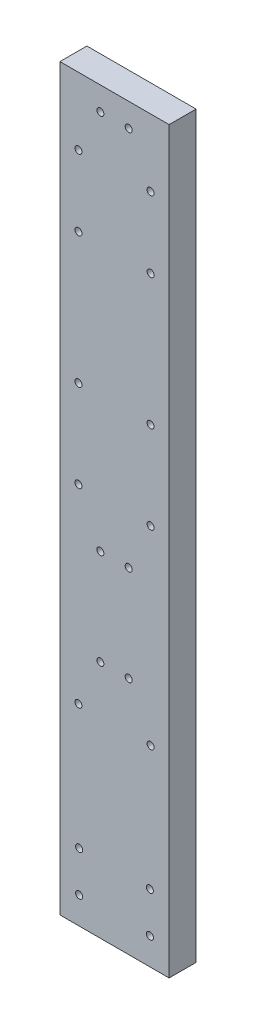
ISO-10303-21;
HEADER;
FILE_DESCRIPTION(('STEP AP214'),'2;1');
FILE_NAME('part.step','',(''),(''),'','','');
FILE_SCHEMA(('AUTOMOTIVE_DESIGN { 1 0 10303 214 1 1 1 1 }'));
ENDSEC;
DATA;
#1=APPLICATION_CONTEXT('core data for automotive mechanical design processes');
#2=APPLICATION_PROTOCOL_DEFINITION('international standard','automotive_design',2000,#1);
#3=PRODUCT_CONTEXT('',#1,'mechanical');
#4=PRODUCT('Part','Part','',(#3));
#5=PRODUCT_RELATED_PRODUCT_CATEGORY('part','',(#4));
#6=PRODUCT_DEFINITION_FORMATION('','',#4);
#7=PRODUCT_DEFINITION_CONTEXT('part definition',#1,'design');
#8=PRODUCT_DEFINITION('design','',#6,#7);
#9=PRODUCT_DEFINITION_SHAPE('','',#8);
#10=(LENGTH_UNIT() NAMED_UNIT(*) SI_UNIT(.MILLI.,.METRE.));
#11=(NAMED_UNIT(*) PLANE_ANGLE_UNIT() SI_UNIT($,.RADIAN.));
#12=(NAMED_UNIT(*) SI_UNIT($,.STERADIAN.) SOLID_ANGLE_UNIT());
#13=UNCERTAINTY_MEASURE_WITH_UNIT(LENGTH_MEASURE(1.E-05),#10,'distance_accuracy_value','');
#14=(GEOMETRIC_REPRESENTATION_CONTEXT(3) GLOBAL_UNCERTAINTY_ASSIGNED_CONTEXT((#13)) GLOBAL_UNIT_ASSIGNED_CONTEXT((#10,
#11,#12)) REPRESENTATION_CONTEXT('',''));
#15=CARTESIAN_POINT('',(0.,0.,0.));
#16=DIRECTION('',(0.,0.,1.));
#17=DIRECTION('',(1.,0.,0.));
#18=AXIS2_PLACEMENT_3D('',#15,#16,#17);
#19=CARTESIAN_POINT('',(0.,0.,4.));
#20=DIRECTION('',(0.,0.,1.));
#21=DIRECTION('',(1.,0.,0.));
#22=AXIS2_PLACEMENT_3D('',#19,#20,#21);
#23=PLANE('',#22);
#24=CARTESIAN_POINT('',(13.35,10.,4.));
#25=DIRECTION('',(0.,0.,1.));
#26=DIRECTION('',(-1.,0.,0.));
#27=AXIS2_PLACEMENT_3D('',#24,#25,#26);
#28=CIRCLE('',#27,0.519960121099864);
#29=CARTESIAN_POINT('',(12.8300398789001,10.,4.));
#30=VERTEX_POINT('',#29);
#31=EDGE_CURVE('E217',#30,#30,#28,.T.);
#32=ORIENTED_EDGE('',*,*,#31,.F.);
#33=EDGE_LOOP('',(#32));
#34=FACE_BOUND('',#33,.T.);
#35=CARTESIAN_POINT('',(2.85,10.,4.));
#36=DIRECTION('',(0.,0.,1.));
#37=DIRECTION('',(1.,0.,0.));
#38=AXIS2_PLACEMENT_3D('',#35,#36,#37);
#39=CIRCLE('',#38,0.519960121099865);
#40=CARTESIAN_POINT('',(3.36996012109986,10.,4.));
#41=VERTEX_POINT('',#40);
#42=EDGE_CURVE('E205',#41,#41,#39,.T.);
#43=ORIENTED_EDGE('',*,*,#42,.F.);
#44=EDGE_LOOP('',(#43));
#45=FACE_BOUND('',#44,.T.);
#46=CARTESIAN_POINT('',(2.74999999999998,69.71,4.));
#47=DIRECTION('',(0.,0.,1.));
#48=DIRECTION('',(1.,0.,0.));
#49=AXIS2_PLACEMENT_3D('',#46,#47,#48);
#50=CIRCLE('',#49,0.519960121099858);
#51=CARTESIAN_POINT('',(3.26996012109984,69.71,4.));
#52=VERTEX_POINT('',#51);
#53=EDGE_CURVE('E193',#52,#52,#50,.T.);
#54=ORIENTED_EDGE('',*,*,#53,.F.);
#55=EDGE_LOOP('',(#54));
#56=FACE_BOUND('',#55,.T.);
#57=CARTESIAN_POINT('',(2.74999999999999,56.71,4.));
#58=DIRECTION('',(0.,0.,1.));
#59=DIRECTION('',(1.,0.,0.));
#60=AXIS2_PLACEMENT_3D('',#57,#58,#59);
#61=CIRCLE('',#60,0.519960121099858);
#62=CARTESIAN_POINT('',(3.26996012109985,56.71,4.));
#63=VERTEX_POINT('',#62);
#64=EDGE_CURVE('E181',#63,#63,#61,.T.);
#65=ORIENTED_EDGE('',*,*,#64,.F.);
#66=EDGE_LOOP('',(#65));
#67=FACE_BOUND('',#66,.T.);
#68=CARTESIAN_POINT('',(10.2,106.16,4.));
#69=DIRECTION('',(0.,0.,1.));
#70=DIRECTION('',(-1.,0.,0.));
#71=AXIS2_PLACEMENT_3D('',#68,#69,#70);
#72=CIRCLE('',#71,0.519960121099869);
#73=CARTESIAN_POINT('',(9.68003987890012,106.16,4.));
#74=VERTEX_POINT('',#73);
#75=EDGE_CURVE('E169',#74,#74,#72,.T.);
#76=ORIENTED_EDGE('',*,*,#75,.F.);
#77=EDGE_LOOP('',(#76));
#78=FACE_BOUND('',#77,.T.);
#79=CARTESIAN_POINT('',(2.74999999999998,89.16,4.));
#80=DIRECTION('',(0.,0.,1.));
#81=DIRECTION('',(-1.,0.,0.));
#82=AXIS2_PLACEMENT_3D('',#79,#80,#81);
#83=CIRCLE('',#82,0.51996012109986);
#84=CARTESIAN_POINT('',(2.23003987890013,89.16,4.));
#85=VERTEX_POINT('',#84);
#86=EDGE_CURVE('E157',#85,#85,#83,.T.);
#87=ORIENTED_EDGE('',*,*,#86,.F.);
#88=EDGE_LOOP('',(#87));
#89=FACE_BOUND('',#88,.T.);
#90=CARTESIAN_POINT('',(2.75,28.5,4.));
#91=DIRECTION('',(0.,0.,1.));
#92=DIRECTION('',(1.,0.,0.));
#93=AXIS2_PLACEMENT_3D('',#90,#91,#92);
#94=CIRCLE('',#93,0.519960121099867);
#95=CARTESIAN_POINT('',(3.26996012109986,28.5,4.));
#96=VERTEX_POINT('',#95);
#97=EDGE_CURVE('E145',#96,#96,#94,.T.);
#98=ORIENTED_EDGE('',*,*,#97,.F.);
#99=EDGE_LOOP('',(#98));
#100=FACE_BOUND('',#99,.T.);
#101=CARTESIAN_POINT('',(6.,35.5,4.));
#102=DIRECTION('',(0.,0.,1.));
#103=DIRECTION('',(1.,0.,0.));
#104=AXIS2_PLACEMENT_3D('',#101,#102,#103);
#105=CIRCLE('',#104,0.51996012109988);
#106=CARTESIAN_POINT('',(6.51996012109988,35.5,4.));
#107=VERTEX_POINT('',#106);
#108=EDGE_CURVE('E133',#107,#107,#105,.T.);
#109=ORIENTED_EDGE('',*,*,#108,.F.);
#110=EDGE_LOOP('',(#109));
#111=FACE_BOUND('',#110,.T.);
#112=CARTESIAN_POINT('',(5.99999999999999,49.71,4.));
#113=DIRECTION('',(0.,0.,1.));
#114=DIRECTION('',(1.,0.,0.));
#115=AXIS2_PLACEMENT_3D('',#112,#113,#114);
#116=CIRCLE('',#115,0.519960121099861);
#117=CARTESIAN_POINT('',(6.51996012109985,49.71,4.));
#118=VERTEX_POINT('',#117);
#119=EDGE_CURVE('E121',#118,#118,#116,.T.);
#120=ORIENTED_EDGE('',*,*,#119,.F.);
#121=EDGE_LOOP('',(#120));
#122=FACE_BOUND('',#121,.T.);
#123=CARTESIAN_POINT('',(5.99999999999999,106.16,4.));
#124=DIRECTION('',(0.,0.,1.));
#125=DIRECTION('',(1.,0.,0.));
#126=AXIS2_PLACEMENT_3D('',#123,#124,#125);
#127=CIRCLE('',#126,0.519960121099861);
#128=CARTESIAN_POINT('',(6.51996012109985,106.16,4.));
#129=VERTEX_POINT('',#128);
#130=EDGE_CURVE('E100',#129,#129,#127,.T.);
#131=ORIENTED_EDGE('',*,*,#130,.F.);
#132=EDGE_LOOP('',(#131));
#133=FACE_BOUND('',#132,.T.);
#134=DIRECTION('',(0.,-1.,0.));
#135=VECTOR('',#134,1.);
#136=CARTESIAN_POINT('',(0.,109.64,4.));
#137=LINE('',#136,#135);
#138=CARTESIAN_POINT('',(0.,109.64,4.));
#139=VERTEX_POINT('',#138);
#140=CARTESIAN_POINT('',(0.,0.,4.));
#141=VERTEX_POINT('',#140);
#142=EDGE_CURVE('E85',#139,#141,#137,.T.);
#143=ORIENTED_EDGE('',*,*,#142,.T.);
#144=DIRECTION('',(1.,0.,0.));
#145=VECTOR('',#144,1.);
#146=CARTESIAN_POINT('',(0.,0.,4.));
#147=LINE('',#146,#145);
#148=CARTESIAN_POINT('',(16.2,0.,4.));
#149=VERTEX_POINT('',#148);
#150=EDGE_CURVE('E80',#141,#149,#147,.T.);
#151=ORIENTED_EDGE('',*,*,#150,.T.);
#152=DIRECTION('',(0.,1.,0.));
#153=VECTOR('',#152,1.);
#154=CARTESIAN_POINT('',(16.2,0.,4.));
#155=LINE('',#154,#153);
#156=CARTESIAN_POINT('',(16.2,109.64,4.));
#157=VERTEX_POINT('',#156);
#158=EDGE_CURVE('E83',#149,#157,#155,.T.);
#159=ORIENTED_EDGE('',*,*,#158,.T.);
#160=DIRECTION('',(-1.,0.,0.));
#161=VECTOR('',#160,1.);
#162=CARTESIAN_POINT('',(16.2,109.64,4.));
#163=LINE('',#162,#161);
#164=EDGE_CURVE('E50',#157,#139,#163,.T.);
#165=ORIENTED_EDGE('',*,*,#164,.T.);
#166=EDGE_LOOP('',(#143,#151,#159,#165));
#167=FACE_BOUND('',#166,.T.);
#168=CARTESIAN_POINT('',(10.2,49.71,4.));
#169=DIRECTION('',(0.,0.,1.));
#170=DIRECTION('',(1.,0.,0.));
#171=AXIS2_PLACEMENT_3D('',#168,#169,#170);
#172=CIRCLE('',#171,0.519960121099864);
#173=CARTESIAN_POINT('',(10.7199601210999,49.71,4.));
#174=VERTEX_POINT('',#173);
#175=EDGE_CURVE('E115',#174,#174,#172,.T.);
#176=ORIENTED_EDGE('',*,*,#175,.F.);
#177=EDGE_LOOP('',(#176));
#178=FACE_BOUND('',#177,.T.);
#179=CARTESIAN_POINT('',(10.2,35.5,4.));
#180=DIRECTION('',(0.,0.,1.));
#181=DIRECTION('',(1.,0.,0.));
#182=AXIS2_PLACEMENT_3D('',#179,#180,#181);
#183=CIRCLE('',#182,0.519960121099865);
#184=CARTESIAN_POINT('',(10.7199601210999,35.5,4.));
#185=VERTEX_POINT('',#184);
#186=EDGE_CURVE('E127',#185,#185,#183,.T.);
#187=ORIENTED_EDGE('',*,*,#186,.F.);
#188=EDGE_LOOP('',(#187));
#189=FACE_BOUND('',#188,.T.);
#190=CARTESIAN_POINT('',(13.45,28.5,4.));
#191=DIRECTION('',(0.,0.,1.));
#192=DIRECTION('',(1.,0.,0.));
#193=AXIS2_PLACEMENT_3D('',#190,#191,#192);
#194=CIRCLE('',#193,0.519960121099865);
#195=CARTESIAN_POINT('',(13.9699601210999,28.5,4.));
#196=VERTEX_POINT('',#195);
#197=EDGE_CURVE('E139',#196,#196,#194,.T.);
#198=ORIENTED_EDGE('',*,*,#197,.F.);
#199=EDGE_LOOP('',(#198));
#200=FACE_BOUND('',#199,.T.);
#201=CARTESIAN_POINT('',(13.45,56.71,4.));
#202=DIRECTION('',(0.,0.,1.));
#203=DIRECTION('',(1.,0.,0.));
#204=AXIS2_PLACEMENT_3D('',#201,#202,#203);
#205=CIRCLE('',#204,0.519960121099861);
#206=CARTESIAN_POINT('',(13.9699601210999,56.71,4.));
#207=VERTEX_POINT('',#206);
#208=EDGE_CURVE('E151',#207,#207,#205,.T.);
#209=ORIENTED_EDGE('',*,*,#208,.F.);
#210=EDGE_LOOP('',(#209));
#211=FACE_BOUND('',#210,.T.);
#212=CARTESIAN_POINT('',(13.45,89.16,4.));
#213=DIRECTION('',(0.,0.,1.));
#214=DIRECTION('',(-1.,0.,0.));
#215=AXIS2_PLACEMENT_3D('',#212,#213,#214);
#216=CIRCLE('',#215,0.519960121099861);
#217=CARTESIAN_POINT('',(12.9300398789002,89.16,4.));
#218=VERTEX_POINT('',#217);
#219=EDGE_CURVE('E163',#218,#218,#216,.T.);
#220=ORIENTED_EDGE('',*,*,#219,.F.);
#221=EDGE_LOOP('',(#220));
#222=FACE_BOUND('',#221,.T.);
#223=CARTESIAN_POINT('',(13.45,99.66,4.));
#224=DIRECTION('',(0.,0.,1.));
#225=DIRECTION('',(-1.,0.,0.));
#226=AXIS2_PLACEMENT_3D('',#223,#224,#225);
#227=CIRCLE('',#226,0.519960121099862);
#228=CARTESIAN_POINT('',(12.9300398789001,99.66,4.));
#229=VERTEX_POINT('',#228);
#230=EDGE_CURVE('E175',#229,#229,#227,.T.);
#231=ORIENTED_EDGE('',*,*,#230,.F.);
#232=EDGE_LOOP('',(#231));
#233=FACE_BOUND('',#232,.T.);
#234=CARTESIAN_POINT('',(13.45,69.71,4.));
#235=DIRECTION('',(0.,0.,1.));
#236=DIRECTION('',(1.,0.,0.));
#237=AXIS2_PLACEMENT_3D('',#234,#235,#236);
#238=CIRCLE('',#237,0.519960121099861);
#239=CARTESIAN_POINT('',(13.9699601210999,69.71,4.));
#240=VERTEX_POINT('',#239);
#241=EDGE_CURVE('E187',#240,#240,#238,.T.);
#242=ORIENTED_EDGE('',*,*,#241,.F.);
#243=EDGE_LOOP('',(#242));
#244=FACE_BOUND('',#243,.T.);
#245=CARTESIAN_POINT('',(2.74999999999999,99.66,4.));
#246=DIRECTION('',(0.,0.,1.));
#247=DIRECTION('',(1.,0.,0.));
#248=AXIS2_PLACEMENT_3D('',#245,#246,#247);
#249=CIRCLE('',#248,0.51996012109986);
#250=CARTESIAN_POINT('',(3.26996012109985,99.66,4.));
#251=VERTEX_POINT('',#250);
#252=EDGE_CURVE('E199',#251,#251,#249,.T.);
#253=ORIENTED_EDGE('',*,*,#252,.F.);
#254=EDGE_LOOP('',(#253));
#255=FACE_BOUND('',#254,.T.);
#256=CARTESIAN_POINT('',(2.85,4.,4.));
#257=DIRECTION('',(0.,0.,1.));
#258=DIRECTION('',(1.,0.,0.));
#259=AXIS2_PLACEMENT_3D('',#256,#257,#258);
#260=CIRCLE('',#259,0.519960121099865);
#261=CARTESIAN_POINT('',(3.36996012109986,4.,4.));
#262=VERTEX_POINT('',#261);
#263=EDGE_CURVE('E211',#262,#262,#260,.T.);
#264=ORIENTED_EDGE('',*,*,#263,.F.);
#265=EDGE_LOOP('',(#264));
#266=FACE_BOUND('',#265,.T.);
#267=CARTESIAN_POINT('',(13.35,4.,4.));
#268=DIRECTION('',(0.,0.,1.));
#269=DIRECTION('',(-1.,0.,0.));
#270=AXIS2_PLACEMENT_3D('',#267,#268,#269);
#271=CIRCLE('',#270,0.519960121099864);
#272=CARTESIAN_POINT('',(12.8300398789001,4.,4.));
#273=VERTEX_POINT('',#272);
#274=EDGE_CURVE('E223',#273,#273,#271,.T.);
#275=ORIENTED_EDGE('',*,*,#274,.F.);
#276=EDGE_LOOP('',(#275));
#277=FACE_BOUND('',#276,.T.);
#278=ADVANCED_FACE('F33',(#34,#45,#56,#67,#78,#89,#100,#111,#122,#133,#167,#178,#189,#200,#211,
#222,#233,#244,#255,#266,#277),#23,.T.);
#279=CARTESIAN_POINT('',(0.,0.,0.));
#280=DIRECTION('',(0.,0.,1.));
#281=DIRECTION('',(1.,0.,0.));
#282=AXIS2_PLACEMENT_3D('',#279,#280,#281);
#283=PLANE('',#282);
#284=CARTESIAN_POINT('',(13.35,10.,0.));
#285=DIRECTION('',(0.,0.,1.));
#286=DIRECTION('',(-1.,0.,0.));
#287=AXIS2_PLACEMENT_3D('',#284,#285,#286);
#288=CIRCLE('',#287,0.519960121099864);
#289=CARTESIAN_POINT('',(12.8300398789001,10.,0.));
#290=VERTEX_POINT('',#289);
#291=EDGE_CURVE('E220',#290,#290,#288,.T.);
#292=ORIENTED_EDGE('',*,*,#291,.T.);
#293=EDGE_LOOP('',(#292));
#294=FACE_BOUND('',#293,.T.);
#295=CARTESIAN_POINT('',(2.85,10.,0.));
#296=DIRECTION('',(0.,0.,1.));
#297=DIRECTION('',(1.,0.,0.));
#298=AXIS2_PLACEMENT_3D('',#295,#296,#297);
#299=CIRCLE('',#298,0.519960121099865);
#300=CARTESIAN_POINT('',(3.36996012109986,10.,0.));
#301=VERTEX_POINT('',#300);
#302=EDGE_CURVE('E208',#301,#301,#299,.T.);
#303=ORIENTED_EDGE('',*,*,#302,.T.);
#304=EDGE_LOOP('',(#303));
#305=FACE_BOUND('',#304,.T.);
#306=CARTESIAN_POINT('',(2.74999999999998,69.71,0.));
#307=DIRECTION('',(0.,0.,1.));
#308=DIRECTION('',(1.,0.,0.));
#309=AXIS2_PLACEMENT_3D('',#306,#307,#308);
#310=CIRCLE('',#309,0.519960121099858);
#311=CARTESIAN_POINT('',(3.26996012109984,69.71,0.));
#312=VERTEX_POINT('',#311);
#313=EDGE_CURVE('E196',#312,#312,#310,.T.);
#314=ORIENTED_EDGE('',*,*,#313,.T.);
#315=EDGE_LOOP('',(#314));
#316=FACE_BOUND('',#315,.T.);
#317=CARTESIAN_POINT('',(2.74999999999999,56.71,0.));
#318=DIRECTION('',(0.,0.,1.));
#319=DIRECTION('',(1.,0.,0.));
#320=AXIS2_PLACEMENT_3D('',#317,#318,#319);
#321=CIRCLE('',#320,0.519960121099858);
#322=CARTESIAN_POINT('',(3.26996012109985,56.71,0.));
#323=VERTEX_POINT('',#322);
#324=EDGE_CURVE('E184',#323,#323,#321,.T.);
#325=ORIENTED_EDGE('',*,*,#324,.T.);
#326=EDGE_LOOP('',(#325));
#327=FACE_BOUND('',#326,.T.);
#328=CARTESIAN_POINT('',(10.2,106.16,0.));
#329=DIRECTION('',(0.,0.,1.));
#330=DIRECTION('',(-1.,0.,0.));
#331=AXIS2_PLACEMENT_3D('',#328,#329,#330);
#332=CIRCLE('',#331,0.519960121099869);
#333=CARTESIAN_POINT('',(9.68003987890012,106.16,0.));
#334=VERTEX_POINT('',#333);
#335=EDGE_CURVE('E172',#334,#334,#332,.T.);
#336=ORIENTED_EDGE('',*,*,#335,.T.);
#337=EDGE_LOOP('',(#336));
#338=FACE_BOUND('',#337,.T.);
#339=CARTESIAN_POINT('',(2.74999999999998,89.16,0.));
#340=DIRECTION('',(0.,0.,1.));
#341=DIRECTION('',(-1.,0.,0.));
#342=AXIS2_PLACEMENT_3D('',#339,#340,#341);
#343=CIRCLE('',#342,0.51996012109986);
#344=CARTESIAN_POINT('',(2.23003987890013,89.16,0.));
#345=VERTEX_POINT('',#344);
#346=EDGE_CURVE('E160',#345,#345,#343,.T.);
#347=ORIENTED_EDGE('',*,*,#346,.T.);
#348=EDGE_LOOP('',(#347));
#349=FACE_BOUND('',#348,.T.);
#350=CARTESIAN_POINT('',(2.75,28.5,0.));
#351=DIRECTION('',(0.,0.,1.));
#352=DIRECTION('',(1.,0.,0.));
#353=AXIS2_PLACEMENT_3D('',#350,#351,#352);
#354=CIRCLE('',#353,0.519960121099867);
#355=CARTESIAN_POINT('',(3.26996012109986,28.5,0.));
#356=VERTEX_POINT('',#355);
#357=EDGE_CURVE('E148',#356,#356,#354,.T.);
#358=ORIENTED_EDGE('',*,*,#357,.T.);
#359=EDGE_LOOP('',(#358));
#360=FACE_BOUND('',#359,.T.);
#361=CARTESIAN_POINT('',(6.,35.5,0.));
#362=DIRECTION('',(0.,0.,1.));
#363=DIRECTION('',(1.,0.,0.));
#364=AXIS2_PLACEMENT_3D('',#361,#362,#363);
#365=CIRCLE('',#364,0.51996012109988);
#366=CARTESIAN_POINT('',(6.51996012109988,35.5,0.));
#367=VERTEX_POINT('',#366);
#368=EDGE_CURVE('E136',#367,#367,#365,.T.);
#369=ORIENTED_EDGE('',*,*,#368,.T.);
#370=EDGE_LOOP('',(#369));
#371=FACE_BOUND('',#370,.T.);
#372=CARTESIAN_POINT('',(5.99999999999999,49.71,0.));
#373=DIRECTION('',(0.,0.,1.));
#374=DIRECTION('',(1.,0.,0.));
#375=AXIS2_PLACEMENT_3D('',#372,#373,#374);
#376=CIRCLE('',#375,0.519960121099861);
#377=CARTESIAN_POINT('',(6.51996012109985,49.71,0.));
#378=VERTEX_POINT('',#377);
#379=EDGE_CURVE('E124',#378,#378,#376,.T.);
#380=ORIENTED_EDGE('',*,*,#379,.T.);
#381=EDGE_LOOP('',(#380));
#382=FACE_BOUND('',#381,.T.);
#383=CARTESIAN_POINT('',(5.99999999999999,106.16,0.));
#384=DIRECTION('',(0.,0.,1.));
#385=DIRECTION('',(1.,0.,0.));
#386=AXIS2_PLACEMENT_3D('',#383,#384,#385);
#387=CIRCLE('',#386,0.519960121099861);
#388=CARTESIAN_POINT('',(6.51996012109985,106.16,0.));
#389=VERTEX_POINT('',#388);
#390=EDGE_CURVE('E112',#389,#389,#387,.T.);
#391=ORIENTED_EDGE('',*,*,#390,.T.);
#392=EDGE_LOOP('',(#391));
#393=FACE_BOUND('',#392,.T.);
#394=DIRECTION('',(0.,-1.,0.));
#395=VECTOR('',#394,1.);
#396=CARTESIAN_POINT('',(0.,109.64,0.));
#397=LINE('',#396,#395);
#398=CARTESIAN_POINT('',(0.,109.64,0.));
#399=VERTEX_POINT('',#398);
#400=CARTESIAN_POINT('',(0.,0.,0.));
#401=VERTEX_POINT('',#400);
#402=EDGE_CURVE('E97',#399,#401,#397,.T.);
#403=ORIENTED_EDGE('',*,*,#402,.F.);
#404=DIRECTION('',(-1.,0.,0.));
#405=VECTOR('',#404,1.);
#406=CARTESIAN_POINT('',(16.2,109.64,0.));
#407=LINE('',#406,#405);
#408=CARTESIAN_POINT('',(16.2,109.64,0.));
#409=VERTEX_POINT('',#408);
#410=EDGE_CURVE('E73',#409,#399,#407,.T.);
#411=ORIENTED_EDGE('',*,*,#410,.F.);
#412=DIRECTION('',(0.,1.,0.));
#413=VECTOR('',#412,1.);
#414=CARTESIAN_POINT('',(16.2,0.,0.));
#415=LINE('',#414,#413);
#416=CARTESIAN_POINT('',(16.2,0.,0.));
#417=VERTEX_POINT('',#416);
#418=EDGE_CURVE('E67',#417,#409,#415,.T.);
#419=ORIENTED_EDGE('',*,*,#418,.F.);
#420=DIRECTION('',(1.,0.,0.));
#421=VECTOR('',#420,1.);
#422=CARTESIAN_POINT('',(0.,0.,0.));
#423=LINE('',#422,#421);
#424=EDGE_CURVE('E89',#401,#417,#423,.T.);
#425=ORIENTED_EDGE('',*,*,#424,.F.);
#426=EDGE_LOOP('',(#403,#411,#419,#425));
#427=FACE_BOUND('',#426,.T.);
#428=CARTESIAN_POINT('',(10.2,49.71,0.));
#429=DIRECTION('',(0.,0.,1.));
#430=DIRECTION('',(1.,0.,0.));
#431=AXIS2_PLACEMENT_3D('',#428,#429,#430);
#432=CIRCLE('',#431,0.519960121099864);
#433=CARTESIAN_POINT('',(10.7199601210999,49.71,0.));
#434=VERTEX_POINT('',#433);
#435=EDGE_CURVE('E118',#434,#434,#432,.T.);
#436=ORIENTED_EDGE('',*,*,#435,.T.);
#437=EDGE_LOOP('',(#436));
#438=FACE_BOUND('',#437,.T.);
#439=CARTESIAN_POINT('',(10.2,35.5,0.));
#440=DIRECTION('',(0.,0.,1.));
#441=DIRECTION('',(1.,0.,0.));
#442=AXIS2_PLACEMENT_3D('',#439,#440,#441);
#443=CIRCLE('',#442,0.519960121099865);
#444=CARTESIAN_POINT('',(10.7199601210999,35.5,0.));
#445=VERTEX_POINT('',#444);
#446=EDGE_CURVE('E130',#445,#445,#443,.T.);
#447=ORIENTED_EDGE('',*,*,#446,.T.);
#448=EDGE_LOOP('',(#447));
#449=FACE_BOUND('',#448,.T.);
#450=CARTESIAN_POINT('',(13.45,28.5,0.));
#451=DIRECTION('',(0.,0.,1.));
#452=DIRECTION('',(1.,0.,0.));
#453=AXIS2_PLACEMENT_3D('',#450,#451,#452);
#454=CIRCLE('',#453,0.519960121099865);
#455=CARTESIAN_POINT('',(13.9699601210999,28.5,0.));
#456=VERTEX_POINT('',#455);
#457=EDGE_CURVE('E142',#456,#456,#454,.T.);
#458=ORIENTED_EDGE('',*,*,#457,.T.);
#459=EDGE_LOOP('',(#458));
#460=FACE_BOUND('',#459,.T.);
#461=CARTESIAN_POINT('',(13.45,56.71,0.));
#462=DIRECTION('',(0.,0.,1.));
#463=DIRECTION('',(1.,0.,0.));
#464=AXIS2_PLACEMENT_3D('',#461,#462,#463);
#465=CIRCLE('',#464,0.519960121099861);
#466=CARTESIAN_POINT('',(13.9699601210999,56.71,0.));
#467=VERTEX_POINT('',#466);
#468=EDGE_CURVE('E154',#467,#467,#465,.T.);
#469=ORIENTED_EDGE('',*,*,#468,.T.);
#470=EDGE_LOOP('',(#469));
#471=FACE_BOUND('',#470,.T.);
#472=CARTESIAN_POINT('',(13.45,89.16,0.));
#473=DIRECTION('',(0.,0.,1.));
#474=DIRECTION('',(-1.,0.,0.));
#475=AXIS2_PLACEMENT_3D('',#472,#473,#474);
#476=CIRCLE('',#475,0.519960121099861);
#477=CARTESIAN_POINT('',(12.9300398789002,89.16,0.));
#478=VERTEX_POINT('',#477);
#479=EDGE_CURVE('E166',#478,#478,#476,.T.);
#480=ORIENTED_EDGE('',*,*,#479,.T.);
#481=EDGE_LOOP('',(#480));
#482=FACE_BOUND('',#481,.T.);
#483=CARTESIAN_POINT('',(13.45,99.66,0.));
#484=DIRECTION('',(0.,0.,1.));
#485=DIRECTION('',(-1.,0.,0.));
#486=AXIS2_PLACEMENT_3D('',#483,#484,#485);
#487=CIRCLE('',#486,0.519960121099862);
#488=CARTESIAN_POINT('',(12.9300398789001,99.66,0.));
#489=VERTEX_POINT('',#488);
#490=EDGE_CURVE('E178',#489,#489,#487,.T.);
#491=ORIENTED_EDGE('',*,*,#490,.T.);
#492=EDGE_LOOP('',(#491));
#493=FACE_BOUND('',#492,.T.);
#494=CARTESIAN_POINT('',(13.45,69.71,0.));
#495=DIRECTION('',(0.,0.,1.));
#496=DIRECTION('',(1.,0.,0.));
#497=AXIS2_PLACEMENT_3D('',#494,#495,#496);
#498=CIRCLE('',#497,0.519960121099861);
#499=CARTESIAN_POINT('',(13.9699601210999,69.71,0.));
#500=VERTEX_POINT('',#499);
#501=EDGE_CURVE('E190',#500,#500,#498,.T.);
#502=ORIENTED_EDGE('',*,*,#501,.T.);
#503=EDGE_LOOP('',(#502));
#504=FACE_BOUND('',#503,.T.);
#505=CARTESIAN_POINT('',(2.74999999999999,99.66,0.));
#506=DIRECTION('',(0.,0.,1.));
#507=DIRECTION('',(1.,0.,0.));
#508=AXIS2_PLACEMENT_3D('',#505,#506,#507);
#509=CIRCLE('',#508,0.51996012109986);
#510=CARTESIAN_POINT('',(3.26996012109985,99.66,0.));
#511=VERTEX_POINT('',#510);
#512=EDGE_CURVE('E202',#511,#511,#509,.T.);
#513=ORIENTED_EDGE('',*,*,#512,.T.);
#514=EDGE_LOOP('',(#513));
#515=FACE_BOUND('',#514,.T.);
#516=CARTESIAN_POINT('',(2.85,4.,0.));
#517=DIRECTION('',(0.,0.,1.));
#518=DIRECTION('',(1.,0.,0.));
#519=AXIS2_PLACEMENT_3D('',#516,#517,#518);
#520=CIRCLE('',#519,0.519960121099865);
#521=CARTESIAN_POINT('',(3.36996012109986,4.,0.));
#522=VERTEX_POINT('',#521);
#523=EDGE_CURVE('E214',#522,#522,#520,.T.);
#524=ORIENTED_EDGE('',*,*,#523,.T.);
#525=EDGE_LOOP('',(#524));
#526=FACE_BOUND('',#525,.T.);
#527=CARTESIAN_POINT('',(13.35,4.,0.));
#528=DIRECTION('',(0.,0.,1.));
#529=DIRECTION('',(-1.,0.,0.));
#530=AXIS2_PLACEMENT_3D('',#527,#528,#529);
#531=CIRCLE('',#530,0.519960121099864);
#532=CARTESIAN_POINT('',(12.8300398789001,4.,0.));
#533=VERTEX_POINT('',#532);
#534=EDGE_CURVE('E226',#533,#533,#531,.T.);
#535=ORIENTED_EDGE('',*,*,#534,.T.);
#536=EDGE_LOOP('',(#535));
#537=FACE_BOUND('',#536,.T.);
#538=ADVANCED_FACE('F108',(#294,#305,#316,#327,#338,#349,#360,#371,#382,#393,#427,#438,#449,
#460,#471,#482,#493,#504,#515,#526,#537),#283,.F.);
#539=CARTESIAN_POINT('',(0.,109.64,4.));
#540=DIRECTION('',(1.,0.,0.));
#541=DIRECTION('',(0.,1.,0.));
#542=AXIS2_PLACEMENT_3D('',#539,#540,#541);
#543=PLANE('',#542);
#544=ORIENTED_EDGE('',*,*,#402,.T.);
#545=DIRECTION('',(0.,0.,-1.));
#546=VECTOR('',#545,1.);
#547=CARTESIAN_POINT('',(0.,0.,4.));
#548=LINE('',#547,#546);
#549=EDGE_CURVE('E11',#141,#401,#548,.T.);
#550=ORIENTED_EDGE('',*,*,#549,.F.);
#551=ORIENTED_EDGE('',*,*,#142,.F.);
#552=DIRECTION('',(0.,0.,-1.));
#553=VECTOR('',#552,1.);
#554=CARTESIAN_POINT('',(0.,109.64,4.));
#555=LINE('',#554,#553);
#556=EDGE_CURVE('E93',#139,#399,#555,.T.);
#557=ORIENTED_EDGE('',*,*,#556,.T.);
#558=EDGE_LOOP('',(#544,#550,#551,#557));
#559=FACE_BOUND('',#558,.T.);
#560=ADVANCED_FACE('F35',(#559),#543,.F.);
#561=CARTESIAN_POINT('',(0.,0.,4.));
#562=DIRECTION('',(0.,1.,0.));
#563=DIRECTION('',(-1.,0.,0.));
#564=AXIS2_PLACEMENT_3D('',#561,#562,#563);
#565=PLANE('',#564);
#566=ORIENTED_EDGE('',*,*,#424,.T.);
#567=DIRECTION('',(0.,0.,-1.));
#568=VECTOR('',#567,1.);
#569=CARTESIAN_POINT('',(16.2,0.,4.));
#570=LINE('',#569,#568);
#571=EDGE_CURVE('E42',#149,#417,#570,.T.);
#572=ORIENTED_EDGE('',*,*,#571,.F.);
#573=ORIENTED_EDGE('',*,*,#150,.F.);
#574=ORIENTED_EDGE('',*,*,#549,.T.);
#575=EDGE_LOOP('',(#566,#572,#573,#574));
#576=FACE_BOUND('',#575,.T.);
#577=ADVANCED_FACE('F88',(#576),#565,.F.);
#578=CARTESIAN_POINT('',(16.2,0.,4.));
#579=DIRECTION('',(-1.,0.,0.));
#580=DIRECTION('',(0.,-1.,0.));
#581=AXIS2_PLACEMENT_3D('',#578,#579,#580);
#582=PLANE('',#581);
#583=ORIENTED_EDGE('',*,*,#418,.T.);
#584=DIRECTION('',(0.,0.,-1.));
#585=VECTOR('',#584,1.);
#586=CARTESIAN_POINT('',(16.2,109.64,4.));
#587=LINE('',#586,#585);
#588=EDGE_CURVE('E90',#157,#409,#587,.T.);
#589=ORIENTED_EDGE('',*,*,#588,.F.);
#590=ORIENTED_EDGE('',*,*,#158,.F.);
#591=ORIENTED_EDGE('',*,*,#571,.T.);
#592=EDGE_LOOP('',(#583,#589,#590,#591));
#593=FACE_BOUND('',#592,.T.);
#594=ADVANCED_FACE('F91',(#593),#582,.F.);
#595=CARTESIAN_POINT('',(16.2,109.64,4.));
#596=DIRECTION('',(0.,-1.,0.));
#597=DIRECTION('',(0.,0.,-1.));
#598=AXIS2_PLACEMENT_3D('',#595,#596,#597);
#599=PLANE('',#598);
#600=ORIENTED_EDGE('',*,*,#410,.T.);
#601=ORIENTED_EDGE('',*,*,#556,.F.);
#602=ORIENTED_EDGE('',*,*,#164,.F.);
#603=ORIENTED_EDGE('',*,*,#588,.T.);
#604=EDGE_LOOP('',(#600,#601,#602,#603));
#605=FACE_BOUND('',#604,.T.);
#606=ADVANCED_FACE('F105',(#605),#599,.F.);
#607=CARTESIAN_POINT('',(5.99999999999999,106.16,4.));
#608=DIRECTION('',(0.,0.,-1.));
#609=DIRECTION('',(-1.,0.,0.));
#610=AXIS2_PLACEMENT_3D('',#607,#608,#609);
#611=CYLINDRICAL_SURFACE('',#610,0.519960121099861);
#612=ORIENTED_EDGE('',*,*,#130,.T.);
#613=EDGE_LOOP('',(#612));
#614=FACE_BOUND('',#613,.T.);
#615=ORIENTED_EDGE('',*,*,#390,.F.);
#616=EDGE_LOOP('',(#615));
#617=FACE_BOUND('',#616,.T.);
#618=ADVANCED_FACE('F246',(#614,#617),#611,.F.);
#619=CARTESIAN_POINT('',(10.2,49.71,4.));
#620=DIRECTION('',(0.,0.,-1.));
#621=DIRECTION('',(-1.,0.,0.));
#622=AXIS2_PLACEMENT_3D('',#619,#620,#621);
#623=CYLINDRICAL_SURFACE('',#622,0.519960121099864);
#624=ORIENTED_EDGE('',*,*,#175,.T.);
#625=EDGE_LOOP('',(#624));
#626=FACE_BOUND('',#625,.T.);
#627=ORIENTED_EDGE('',*,*,#435,.F.);
#628=EDGE_LOOP('',(#627));
#629=FACE_BOUND('',#628,.T.);
#630=ADVANCED_FACE('F292',(#626,#629),#623,.F.);
#631=CARTESIAN_POINT('',(5.99999999999999,49.71,4.));
#632=DIRECTION('',(0.,0.,-1.));
#633=DIRECTION('',(-1.,0.,0.));
#634=AXIS2_PLACEMENT_3D('',#631,#632,#633);
#635=CYLINDRICAL_SURFACE('',#634,0.519960121099861);
#636=ORIENTED_EDGE('',*,*,#119,.T.);
#637=EDGE_LOOP('',(#636));
#638=FACE_BOUND('',#637,.T.);
#639=ORIENTED_EDGE('',*,*,#379,.F.);
#640=EDGE_LOOP('',(#639));
#641=FACE_BOUND('',#640,.T.);
#642=ADVANCED_FACE('F300',(#638,#641),#635,.F.);
#643=CARTESIAN_POINT('',(10.2,35.5,4.));
#644=DIRECTION('',(0.,0.,-1.));
#645=DIRECTION('',(-1.,0.,0.));
#646=AXIS2_PLACEMENT_3D('',#643,#644,#645);
#647=CYLINDRICAL_SURFACE('',#646,0.519960121099865);
#648=ORIENTED_EDGE('',*,*,#186,.T.);
#649=EDGE_LOOP('',(#648));
#650=FACE_BOUND('',#649,.T.);
#651=ORIENTED_EDGE('',*,*,#446,.F.);
#652=EDGE_LOOP('',(#651));
#653=FACE_BOUND('',#652,.T.);
#654=ADVANCED_FACE('F308',(#650,#653),#647,.F.);
#655=CARTESIAN_POINT('',(6.,35.5,4.));
#656=DIRECTION('',(0.,0.,-1.));
#657=DIRECTION('',(-1.,0.,0.));
#658=AXIS2_PLACEMENT_3D('',#655,#656,#657);
#659=CYLINDRICAL_SURFACE('',#658,0.51996012109988);
#660=ORIENTED_EDGE('',*,*,#108,.T.);
#661=EDGE_LOOP('',(#660));
#662=FACE_BOUND('',#661,.T.);
#663=ORIENTED_EDGE('',*,*,#368,.F.);
#664=EDGE_LOOP('',(#663));
#665=FACE_BOUND('',#664,.T.);
#666=ADVANCED_FACE('F317',(#662,#665),#659,.F.);
#667=CARTESIAN_POINT('',(13.45,28.5,4.));
#668=DIRECTION('',(0.,0.,-1.));
#669=DIRECTION('',(-1.,0.,0.));
#670=AXIS2_PLACEMENT_3D('',#667,#668,#669);
#671=CYLINDRICAL_SURFACE('',#670,0.519960121099865);
#672=ORIENTED_EDGE('',*,*,#197,.T.);
#673=EDGE_LOOP('',(#672));
#674=FACE_BOUND('',#673,.T.);
#675=ORIENTED_EDGE('',*,*,#457,.F.);
#676=EDGE_LOOP('',(#675));
#677=FACE_BOUND('',#676,.T.);
#678=ADVANCED_FACE('F326',(#674,#677),#671,.F.);
#679=CARTESIAN_POINT('',(2.75,28.5,4.));
#680=DIRECTION('',(0.,0.,-1.));
#681=DIRECTION('',(-1.,0.,0.));
#682=AXIS2_PLACEMENT_3D('',#679,#680,#681);
#683=CYLINDRICAL_SURFACE('',#682,0.519960121099867);
#684=ORIENTED_EDGE('',*,*,#97,.T.);
#685=EDGE_LOOP('',(#684));
#686=FACE_BOUND('',#685,.T.);
#687=ORIENTED_EDGE('',*,*,#357,.F.);
#688=EDGE_LOOP('',(#687));
#689=FACE_BOUND('',#688,.T.);
#690=ADVANCED_FACE('F335',(#686,#689),#683,.F.);
#691=CARTESIAN_POINT('',(13.45,56.71,4.));
#692=DIRECTION('',(0.,0.,-1.));
#693=DIRECTION('',(-1.,0.,0.));
#694=AXIS2_PLACEMENT_3D('',#691,#692,#693);
#695=CYLINDRICAL_SURFACE('',#694,0.519960121099861);
#696=ORIENTED_EDGE('',*,*,#208,.T.);
#697=EDGE_LOOP('',(#696));
#698=FACE_BOUND('',#697,.T.);
#699=ORIENTED_EDGE('',*,*,#468,.F.);
#700=EDGE_LOOP('',(#699));
#701=FACE_BOUND('',#700,.T.);
#702=ADVANCED_FACE('F344',(#698,#701),#695,.F.);
#703=CARTESIAN_POINT('',(2.74999999999998,89.16,4.));
#704=DIRECTION('',(0.,0.,-1.));
#705=DIRECTION('',(-1.,0.,0.));
#706=AXIS2_PLACEMENT_3D('',#703,#704,#705);
#707=CYLINDRICAL_SURFACE('',#706,0.51996012109986);
#708=ORIENTED_EDGE('',*,*,#86,.T.);
#709=EDGE_LOOP('',(#708));
#710=FACE_BOUND('',#709,.T.);
#711=ORIENTED_EDGE('',*,*,#346,.F.);
#712=EDGE_LOOP('',(#711));
#713=FACE_BOUND('',#712,.T.);
#714=ADVANCED_FACE('F353',(#710,#713),#707,.F.);
#715=CARTESIAN_POINT('',(13.45,89.16,4.));
#716=DIRECTION('',(0.,0.,-1.));
#717=DIRECTION('',(-1.,0.,0.));
#718=AXIS2_PLACEMENT_3D('',#715,#716,#717);
#719=CYLINDRICAL_SURFACE('',#718,0.519960121099861);
#720=ORIENTED_EDGE('',*,*,#219,.T.);
#721=EDGE_LOOP('',(#720));
#722=FACE_BOUND('',#721,.T.);
#723=ORIENTED_EDGE('',*,*,#479,.F.);
#724=EDGE_LOOP('',(#723));
#725=FACE_BOUND('',#724,.T.);
#726=ADVANCED_FACE('F362',(#722,#725),#719,.F.);
#727=CARTESIAN_POINT('',(10.2,106.16,4.));
#728=DIRECTION('',(0.,0.,-1.));
#729=DIRECTION('',(-1.,0.,0.));
#730=AXIS2_PLACEMENT_3D('',#727,#728,#729);
#731=CYLINDRICAL_SURFACE('',#730,0.519960121099869);
#732=ORIENTED_EDGE('',*,*,#75,.T.);
#733=EDGE_LOOP('',(#732));
#734=FACE_BOUND('',#733,.T.);
#735=ORIENTED_EDGE('',*,*,#335,.F.);
#736=EDGE_LOOP('',(#735));
#737=FACE_BOUND('',#736,.T.);
#738=ADVANCED_FACE('F371',(#734,#737),#731,.F.);
#739=CARTESIAN_POINT('',(13.45,99.66,4.));
#740=DIRECTION('',(0.,0.,-1.));
#741=DIRECTION('',(-1.,0.,0.));
#742=AXIS2_PLACEMENT_3D('',#739,#740,#741);
#743=CYLINDRICAL_SURFACE('',#742,0.519960121099862);
#744=ORIENTED_EDGE('',*,*,#230,.T.);
#745=EDGE_LOOP('',(#744));
#746=FACE_BOUND('',#745,.T.);
#747=ORIENTED_EDGE('',*,*,#490,.F.);
#748=EDGE_LOOP('',(#747));
#749=FACE_BOUND('',#748,.T.);
#750=ADVANCED_FACE('F380',(#746,#749),#743,.F.);
#751=CARTESIAN_POINT('',(2.74999999999999,56.71,4.));
#752=DIRECTION('',(0.,0.,-1.));
#753=DIRECTION('',(-1.,0.,0.));
#754=AXIS2_PLACEMENT_3D('',#751,#752,#753);
#755=CYLINDRICAL_SURFACE('',#754,0.519960121099858);
#756=ORIENTED_EDGE('',*,*,#64,.T.);
#757=EDGE_LOOP('',(#756));
#758=FACE_BOUND('',#757,.T.);
#759=ORIENTED_EDGE('',*,*,#324,.F.);
#760=EDGE_LOOP('',(#759));
#761=FACE_BOUND('',#760,.T.);
#762=ADVANCED_FACE('F389',(#758,#761),#755,.F.);
#763=CARTESIAN_POINT('',(13.45,69.71,4.));
#764=DIRECTION('',(0.,0.,-1.));
#765=DIRECTION('',(-1.,0.,0.));
#766=AXIS2_PLACEMENT_3D('',#763,#764,#765);
#767=CYLINDRICAL_SURFACE('',#766,0.519960121099861);
#768=ORIENTED_EDGE('',*,*,#241,.T.);
#769=EDGE_LOOP('',(#768));
#770=FACE_BOUND('',#769,.T.);
#771=ORIENTED_EDGE('',*,*,#501,.F.);
#772=EDGE_LOOP('',(#771));
#773=FACE_BOUND('',#772,.T.);
#774=ADVANCED_FACE('F398',(#770,#773),#767,.F.);
#775=CARTESIAN_POINT('',(2.74999999999998,69.71,4.));
#776=DIRECTION('',(0.,0.,-1.));
#777=DIRECTION('',(-1.,0.,0.));
#778=AXIS2_PLACEMENT_3D('',#775,#776,#777);
#779=CYLINDRICAL_SURFACE('',#778,0.519960121099858);
#780=ORIENTED_EDGE('',*,*,#53,.T.);
#781=EDGE_LOOP('',(#780));
#782=FACE_BOUND('',#781,.T.);
#783=ORIENTED_EDGE('',*,*,#313,.F.);
#784=EDGE_LOOP('',(#783));
#785=FACE_BOUND('',#784,.T.);
#786=ADVANCED_FACE('F407',(#782,#785),#779,.F.);
#787=CARTESIAN_POINT('',(2.74999999999999,99.66,4.));
#788=DIRECTION('',(0.,0.,-1.));
#789=DIRECTION('',(-1.,0.,0.));
#790=AXIS2_PLACEMENT_3D('',#787,#788,#789);
#791=CYLINDRICAL_SURFACE('',#790,0.51996012109986);
#792=ORIENTED_EDGE('',*,*,#252,.T.);
#793=EDGE_LOOP('',(#792));
#794=FACE_BOUND('',#793,.T.);
#795=ORIENTED_EDGE('',*,*,#512,.F.);
#796=EDGE_LOOP('',(#795));
#797=FACE_BOUND('',#796,.T.);
#798=ADVANCED_FACE('F416',(#794,#797),#791,.F.);
#799=CARTESIAN_POINT('',(2.85,10.,4.));
#800=DIRECTION('',(0.,0.,-1.));
#801=DIRECTION('',(-1.,0.,0.));
#802=AXIS2_PLACEMENT_3D('',#799,#800,#801);
#803=CYLINDRICAL_SURFACE('',#802,0.519960121099865);
#804=ORIENTED_EDGE('',*,*,#42,.T.);
#805=EDGE_LOOP('',(#804));
#806=FACE_BOUND('',#805,.T.);
#807=ORIENTED_EDGE('',*,*,#302,.F.);
#808=EDGE_LOOP('',(#807));
#809=FACE_BOUND('',#808,.T.);
#810=ADVANCED_FACE('F425',(#806,#809),#803,.F.);
#811=CARTESIAN_POINT('',(2.85,4.,4.));
#812=DIRECTION('',(0.,0.,-1.));
#813=DIRECTION('',(-1.,0.,0.));
#814=AXIS2_PLACEMENT_3D('',#811,#812,#813);
#815=CYLINDRICAL_SURFACE('',#814,0.519960121099865);
#816=ORIENTED_EDGE('',*,*,#263,.T.);
#817=EDGE_LOOP('',(#816));
#818=FACE_BOUND('',#817,.T.);
#819=ORIENTED_EDGE('',*,*,#523,.F.);
#820=EDGE_LOOP('',(#819));
#821=FACE_BOUND('',#820,.T.);
#822=ADVANCED_FACE('F434',(#818,#821),#815,.F.);
#823=CARTESIAN_POINT('',(13.35,10.,4.));
#824=DIRECTION('',(0.,0.,-1.));
#825=DIRECTION('',(-1.,0.,0.));
#826=AXIS2_PLACEMENT_3D('',#823,#824,#825);
#827=CYLINDRICAL_SURFACE('',#826,0.519960121099864);
#828=ORIENTED_EDGE('',*,*,#31,.T.);
#829=EDGE_LOOP('',(#828));
#830=FACE_BOUND('',#829,.T.);
#831=ORIENTED_EDGE('',*,*,#291,.F.);
#832=EDGE_LOOP('',(#831));
#833=FACE_BOUND('',#832,.T.);
#834=ADVANCED_FACE('F443',(#830,#833),#827,.F.);
#835=CARTESIAN_POINT('',(13.35,4.,4.));
#836=DIRECTION('',(0.,0.,-1.));
#837=DIRECTION('',(-1.,0.,0.));
#838=AXIS2_PLACEMENT_3D('',#835,#836,#837);
#839=CYLINDRICAL_SURFACE('',#838,0.519960121099864);
#840=ORIENTED_EDGE('',*,*,#274,.T.);
#841=EDGE_LOOP('',(#840));
#842=FACE_BOUND('',#841,.T.);
#843=ORIENTED_EDGE('',*,*,#534,.F.);
#844=EDGE_LOOP('',(#843));
#845=FACE_BOUND('',#844,.T.);
#846=ADVANCED_FACE('F232',(#842,#845),#839,.F.);
#847=CLOSED_SHELL('',(#278,#538,#560,#577,#594,#606,#618,#630,#642,#654,#666,#678,#690,#702,
#714,#726,#738,#750,#762,#774,#786,#798,#810,#822,#834,#846));
#848=MANIFOLD_SOLID_BREP('B2',#847);
#849=ADVANCED_BREP_SHAPE_REPRESENTATION('',(#18,#848),#14);
#850=SHAPE_DEFINITION_REPRESENTATION(#9,#849);
ENDSEC;
END-ISO-10303-21;
